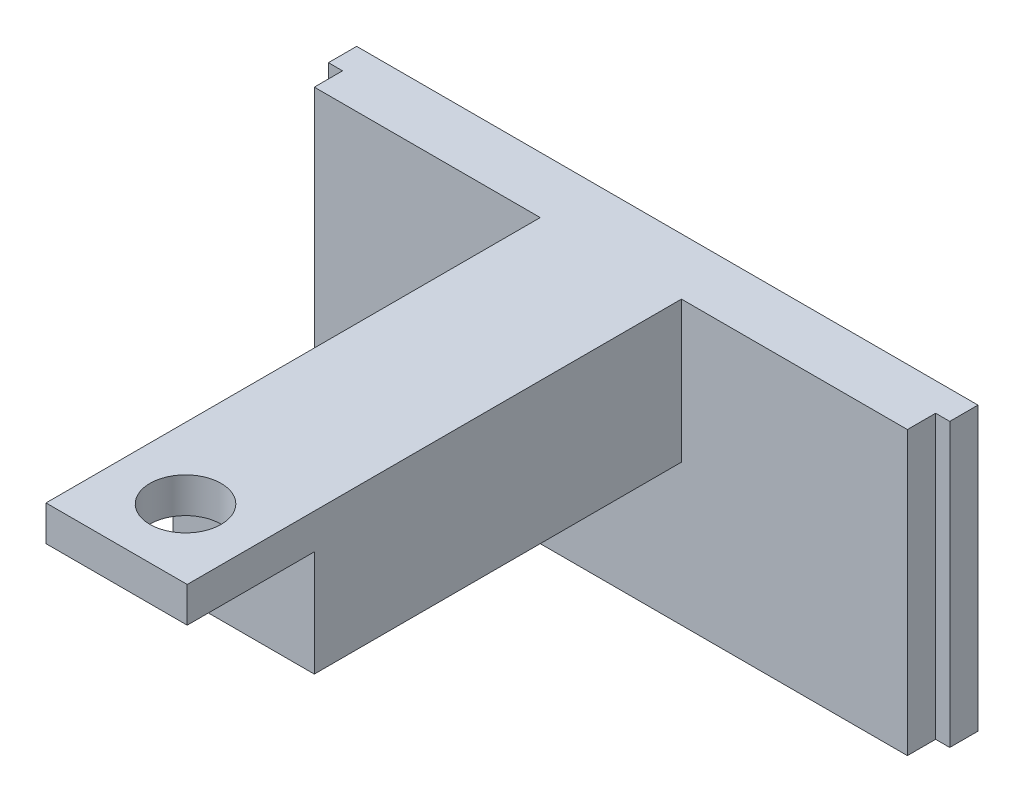
ISO-10303-21;
HEADER;
FILE_DESCRIPTION(('STEP AP214'),'2;1');
FILE_NAME('part.step','',(''),(''),'','','');
FILE_SCHEMA(('AUTOMOTIVE_DESIGN { 1 0 10303 214 1 1 1 1 }'));
ENDSEC;
DATA;
#1=APPLICATION_CONTEXT('core data for automotive mechanical design processes');
#2=APPLICATION_PROTOCOL_DEFINITION('international standard','automotive_design',2000,#1);
#3=PRODUCT_CONTEXT('',#1,'mechanical');
#4=PRODUCT('Part','Part','',(#3));
#5=PRODUCT_RELATED_PRODUCT_CATEGORY('part','',(#4));
#6=PRODUCT_DEFINITION_FORMATION('','',#4);
#7=PRODUCT_DEFINITION_CONTEXT('part definition',#1,'design');
#8=PRODUCT_DEFINITION('design','',#6,#7);
#9=PRODUCT_DEFINITION_SHAPE('','',#8);
#10=(LENGTH_UNIT() NAMED_UNIT(*) SI_UNIT(.MILLI.,.METRE.));
#11=(NAMED_UNIT(*) PLANE_ANGLE_UNIT() SI_UNIT($,.RADIAN.));
#12=(NAMED_UNIT(*) SI_UNIT($,.STERADIAN.) SOLID_ANGLE_UNIT());
#13=UNCERTAINTY_MEASURE_WITH_UNIT(LENGTH_MEASURE(1.E-05),#10,'distance_accuracy_value','');
#14=(GEOMETRIC_REPRESENTATION_CONTEXT(3) GLOBAL_UNCERTAINTY_ASSIGNED_CONTEXT((#13)) GLOBAL_UNIT_ASSIGNED_CONTEXT((#10,
#11,#12)) REPRESENTATION_CONTEXT('',''));
#15=CARTESIAN_POINT('',(0.,0.,0.));
#16=DIRECTION('',(0.,0.,1.));
#17=DIRECTION('',(1.,0.,0.));
#18=AXIS2_PLACEMENT_3D('',#15,#16,#17);
#19=CARTESIAN_POINT('',(5.,10.,39.));
#20=DIRECTION('',(-1.,0.,0.));
#21=DIRECTION('',(0.,-1.,0.));
#22=AXIS2_PLACEMENT_3D('',#19,#20,#21);
#23=PLANE('',#22);
#24=DIRECTION('',(0.,1.,0.));
#25=VECTOR('',#24,1.);
#26=CARTESIAN_POINT('',(4.99999999999999,7.5,30.));
#27=LINE('',#26,#25);
#28=CARTESIAN_POINT('',(4.99999999999999,0.,30.));
#29=VERTEX_POINT('',#28);
#30=CARTESIAN_POINT('',(4.99999999999999,7.5,30.));
#31=VERTEX_POINT('',#30);
#32=EDGE_CURVE('E147',#29,#31,#27,.T.);
#33=ORIENTED_EDGE('',*,*,#32,.F.);
#34=DIRECTION('',(0.,0.,-1.));
#35=VECTOR('',#34,1.);
#36=CARTESIAN_POINT('',(5.,0.,39.));
#37=LINE('',#36,#35);
#38=CARTESIAN_POINT('',(5.,0.,4.));
#39=VERTEX_POINT('',#38);
#40=EDGE_CURVE('E65',#29,#39,#37,.T.);
#41=ORIENTED_EDGE('',*,*,#40,.T.);
#42=DIRECTION('',(0.,1.,0.));
#43=VECTOR('',#42,1.);
#44=CARTESIAN_POINT('',(5.,10.,4.));
#45=LINE('',#44,#43);
#46=CARTESIAN_POINT('',(4.99999999999999,10.,4.));
#47=VERTEX_POINT('',#46);
#48=EDGE_CURVE('E169',#39,#47,#45,.T.);
#49=ORIENTED_EDGE('',*,*,#48,.T.);
#50=DIRECTION('',(0.,0.,-1.));
#51=VECTOR('',#50,1.);
#52=CARTESIAN_POINT('',(5.,10.,39.));
#53=LINE('',#52,#51);
#54=CARTESIAN_POINT('',(5.,10.,39.));
#55=VERTEX_POINT('',#54);
#56=EDGE_CURVE('E190',#55,#47,#53,.T.);
#57=ORIENTED_EDGE('',*,*,#56,.F.);
#58=DIRECTION('',(0.,1.,0.));
#59=VECTOR('',#58,1.);
#60=CARTESIAN_POINT('',(5.,10.,39.));
#61=LINE('',#60,#59);
#62=CARTESIAN_POINT('',(5.,7.5,39.));
#63=VERTEX_POINT('',#62);
#64=EDGE_CURVE('E157',#63,#55,#61,.T.);
#65=ORIENTED_EDGE('',*,*,#64,.F.);
#66=DIRECTION('',(0.,0.,1.));
#67=VECTOR('',#66,1.);
#68=CARTESIAN_POINT('',(4.99999999999999,7.5,30.));
#69=LINE('',#68,#67);
#70=EDGE_CURVE('E54',#31,#63,#69,.T.);
#71=ORIENTED_EDGE('',*,*,#70,.F.);
#72=EDGE_LOOP('',(#33,#41,#49,#57,#65,#71));
#73=FACE_BOUND('',#72,.T.);
#74=ADVANCED_FACE('F39',(#73),#23,.F.);
#75=CARTESIAN_POINT('',(-5.,0.,39.));
#76=DIRECTION('',(0.,1.,0.));
#77=DIRECTION('',(-1.,0.,0.));
#78=AXIS2_PLACEMENT_3D('',#75,#76,#77);
#79=PLANE('',#78);
#80=DIRECTION('',(1.,0.,0.));
#81=VECTOR('',#80,1.);
#82=CARTESIAN_POINT('',(-5.00000000000001,0.,30.));
#83=LINE('',#82,#81);
#84=CARTESIAN_POINT('',(-5.00000000000001,0.,30.));
#85=VERTEX_POINT('',#84);
#86=EDGE_CURVE('E152',#85,#29,#83,.T.);
#87=ORIENTED_EDGE('',*,*,#86,.F.);
#88=DIRECTION('',(0.,0.,-1.));
#89=VECTOR('',#88,1.);
#90=CARTESIAN_POINT('',(-5.,0.,39.));
#91=LINE('',#90,#89);
#92=CARTESIAN_POINT('',(-5.,0.,4.));
#93=VERTEX_POINT('',#92);
#94=EDGE_CURVE('E181',#85,#93,#91,.T.);
#95=ORIENTED_EDGE('',*,*,#94,.T.);
#96=DIRECTION('',(1.,0.,0.));
#97=VECTOR('',#96,1.);
#98=CARTESIAN_POINT('',(-5.,0.,4.));
#99=LINE('',#98,#97);
#100=EDGE_CURVE('E174',#93,#39,#99,.T.);
#101=ORIENTED_EDGE('',*,*,#100,.T.);
#102=ORIENTED_EDGE('',*,*,#40,.F.);
#103=EDGE_LOOP('',(#87,#95,#101,#102));
#104=FACE_BOUND('',#103,.T.);
#105=ADVANCED_FACE('F293',(#104),#79,.F.);
#106=CARTESIAN_POINT('',(0.,0.,2.));
#107=DIRECTION('',(0.,0.,1.));
#108=DIRECTION('',(1.,0.,0.));
#109=AXIS2_PLACEMENT_3D('',#106,#107,#108);
#110=PLANE('',#109);
#111=DIRECTION('',(0.,1.,0.));
#112=VECTOR('',#111,1.);
#113=CARTESIAN_POINT('',(21.,10.,2.));
#114=LINE('',#113,#112);
#115=CARTESIAN_POINT('',(21.,-10.,2.));
#116=VERTEX_POINT('',#115);
#117=CARTESIAN_POINT('',(21.,10.,2.));
#118=VERTEX_POINT('',#117);
#119=EDGE_CURVE('E193',#116,#118,#114,.T.);
#120=ORIENTED_EDGE('',*,*,#119,.F.);
#121=DIRECTION('',(1.,0.,0.));
#122=VECTOR('',#121,1.);
#123=CARTESIAN_POINT('',(-22.,-10.,2.));
#124=LINE('',#123,#122);
#125=CARTESIAN_POINT('',(22.,-10.,2.));
#126=VERTEX_POINT('',#125);
#127=EDGE_CURVE('E228',#116,#126,#124,.T.);
#128=ORIENTED_EDGE('',*,*,#127,.T.);
#129=DIRECTION('',(0.,1.,0.));
#130=VECTOR('',#129,1.);
#131=CARTESIAN_POINT('',(22.,10.,2.));
#132=LINE('',#131,#130);
#133=CARTESIAN_POINT('',(22.,10.,2.));
#134=VERTEX_POINT('',#133);
#135=EDGE_CURVE('E219',#126,#134,#132,.T.);
#136=ORIENTED_EDGE('',*,*,#135,.T.);
#137=DIRECTION('',(-1.,0.,0.));
#138=VECTOR('',#137,1.);
#139=CARTESIAN_POINT('',(-22.,10.,2.));
#140=LINE('',#139,#138);
#141=EDGE_CURVE('E223',#134,#118,#140,.T.);
#142=ORIENTED_EDGE('',*,*,#141,.T.);
#143=EDGE_LOOP('',(#120,#128,#136,#142));
#144=FACE_BOUND('',#143,.T.);
#145=ADVANCED_FACE('F270',(#144),#110,.T.);
#146=CARTESIAN_POINT('',(22.,10.,2.));
#147=DIRECTION('',(-1.,0.,0.));
#148=DIRECTION('',(0.,-1.,0.));
#149=AXIS2_PLACEMENT_3D('',#146,#147,#148);
#150=PLANE('',#149);
#151=DIRECTION('',(0.,1.,0.));
#152=VECTOR('',#151,1.);
#153=CARTESIAN_POINT('',(22.,10.,0.));
#154=LINE('',#153,#152);
#155=CARTESIAN_POINT('',(22.,-10.,0.));
#156=VERTEX_POINT('',#155);
#157=CARTESIAN_POINT('',(22.,10.,0.));
#158=VERTEX_POINT('',#157);
#159=EDGE_CURVE('E218',#156,#158,#154,.T.);
#160=ORIENTED_EDGE('',*,*,#159,.T.);
#161=DIRECTION('',(0.,0.,-1.));
#162=VECTOR('',#161,1.);
#163=CARTESIAN_POINT('',(22.,10.,2.));
#164=LINE('',#163,#162);
#165=EDGE_CURVE('E11',#134,#158,#164,.T.);
#166=ORIENTED_EDGE('',*,*,#165,.F.);
#167=ORIENTED_EDGE('',*,*,#135,.F.);
#168=DIRECTION('',(0.,0.,-1.));
#169=VECTOR('',#168,1.);
#170=CARTESIAN_POINT('',(22.,-10.,2.));
#171=LINE('',#170,#169);
#172=EDGE_CURVE('E235',#126,#156,#171,.T.);
#173=ORIENTED_EDGE('',*,*,#172,.T.);
#174=EDGE_LOOP('',(#160,#166,#167,#173));
#175=FACE_BOUND('',#174,.T.);
#176=ADVANCED_FACE('F41',(#175),#150,.F.);
#177=CARTESIAN_POINT('',(-22.,10.,2.));
#178=DIRECTION('',(0.,-1.,0.));
#179=DIRECTION('',(0.,0.,-1.));
#180=AXIS2_PLACEMENT_3D('',#177,#178,#179);
#181=PLANE('',#180);
#182=CARTESIAN_POINT('',(0.,10.,34.12));
#183=DIRECTION('',(0.,1.,0.));
#184=DIRECTION('',(0.,0.,1.));
#185=AXIS2_PLACEMENT_3D('',#182,#183,#184);
#186=CIRCLE('',#185,2.52);
#187=CARTESIAN_POINT('',(0.,10.,36.64));
#188=VERTEX_POINT('',#187);
#189=EDGE_CURVE('E164',#188,#188,#186,.T.);
#190=ORIENTED_EDGE('',*,*,#189,.F.);
#191=EDGE_LOOP('',(#190));
#192=FACE_BOUND('',#191,.T.);
#193=DIRECTION('',(-1.,0.,0.));
#194=VECTOR('',#193,1.);
#195=CARTESIAN_POINT('',(-22.,10.,0.));
#196=LINE('',#195,#194);
#197=CARTESIAN_POINT('',(-22.,10.,0.));
#198=VERTEX_POINT('',#197);
#199=EDGE_CURVE('E234',#158,#198,#196,.T.);
#200=ORIENTED_EDGE('',*,*,#199,.T.);
#201=DIRECTION('',(0.,0.,-1.));
#202=VECTOR('',#201,1.);
#203=CARTESIAN_POINT('',(-22.,10.,2.));
#204=LINE('',#203,#202);
#205=CARTESIAN_POINT('',(-22.,10.,2.));
#206=VERTEX_POINT('',#205);
#207=EDGE_CURVE('E48',#206,#198,#204,.T.);
#208=ORIENTED_EDGE('',*,*,#207,.F.);
#209=CARTESIAN_POINT('',(-21.,10.,2.));
#210=VERTEX_POINT('',#209);
#211=EDGE_CURVE('E224',#210,#206,#140,.T.);
#212=ORIENTED_EDGE('',*,*,#211,.F.);
#213=DIRECTION('',(0.,0.,-1.));
#214=VECTOR('',#213,1.);
#215=CARTESIAN_POINT('',(-21.,10.,4.));
#216=LINE('',#215,#214);
#217=CARTESIAN_POINT('',(-21.,10.,4.));
#218=VERTEX_POINT('',#217);
#219=EDGE_CURVE('E213',#218,#210,#216,.T.);
#220=ORIENTED_EDGE('',*,*,#219,.F.);
#221=DIRECTION('',(-1.,0.,0.));
#222=VECTOR('',#221,1.);
#223=CARTESIAN_POINT('',(-21.,10.,4.));
#224=LINE('',#223,#222);
#225=CARTESIAN_POINT('',(-5.00000000000001,10.,4.));
#226=VERTEX_POINT('',#225);
#227=EDGE_CURVE('E194',#226,#218,#224,.T.);
#228=ORIENTED_EDGE('',*,*,#227,.F.);
#229=DIRECTION('',(0.,0.,-1.));
#230=VECTOR('',#229,1.);
#231=CARTESIAN_POINT('',(-5.,10.,39.));
#232=LINE('',#231,#230);
#233=CARTESIAN_POINT('',(-5.,10.,39.));
#234=VERTEX_POINT('',#233);
#235=EDGE_CURVE('E183',#234,#226,#232,.T.);
#236=ORIENTED_EDGE('',*,*,#235,.F.);
#237=DIRECTION('',(-1.,0.,0.));
#238=VECTOR('',#237,1.);
#239=CARTESIAN_POINT('',(-5.,10.,39.));
#240=LINE('',#239,#238);
#241=EDGE_CURVE('E168',#55,#234,#240,.T.);
#242=ORIENTED_EDGE('',*,*,#241,.F.);
#243=ORIENTED_EDGE('',*,*,#56,.T.);
#244=CARTESIAN_POINT('',(21.,10.,4.));
#245=VERTEX_POINT('',#244);
#246=EDGE_CURVE('E197',#245,#47,#224,.T.);
#247=ORIENTED_EDGE('',*,*,#246,.F.);
#248=DIRECTION('',(0.,0.,-1.));
#249=VECTOR('',#248,1.);
#250=CARTESIAN_POINT('',(21.,10.,4.));
#251=LINE('',#250,#249);
#252=EDGE_CURVE('E216',#245,#118,#251,.T.);
#253=ORIENTED_EDGE('',*,*,#252,.T.);
#254=ORIENTED_EDGE('',*,*,#141,.F.);
#255=ORIENTED_EDGE('',*,*,#165,.T.);
#256=EDGE_LOOP('',(#200,#208,#212,#220,#228,#236,#242,#243,#247,#253,#254,#255));
#257=FACE_BOUND('',#256,.T.);
#258=ADVANCED_FACE('F285',(#192,#257),#181,.F.);
#259=CARTESIAN_POINT('',(-22.,10.,2.));
#260=DIRECTION('',(1.,0.,0.));
#261=DIRECTION('',(0.,1.,0.));
#262=AXIS2_PLACEMENT_3D('',#259,#260,#261);
#263=PLANE('',#262);
#264=DIRECTION('',(0.,-1.,0.));
#265=VECTOR('',#264,1.);
#266=CARTESIAN_POINT('',(-22.,10.,0.));
#267=LINE('',#266,#265);
#268=CARTESIAN_POINT('',(-22.,-10.,0.));
#269=VERTEX_POINT('',#268);
#270=EDGE_CURVE('E240',#198,#269,#267,.T.);
#271=ORIENTED_EDGE('',*,*,#270,.T.);
#272=DIRECTION('',(0.,0.,-1.));
#273=VECTOR('',#272,1.);
#274=CARTESIAN_POINT('',(-22.,-10.,2.));
#275=LINE('',#274,#273);
#276=CARTESIAN_POINT('',(-22.,-10.,2.));
#277=VERTEX_POINT('',#276);
#278=EDGE_CURVE('E241',#277,#269,#275,.T.);
#279=ORIENTED_EDGE('',*,*,#278,.F.);
#280=DIRECTION('',(0.,-1.,0.));
#281=VECTOR('',#280,1.);
#282=CARTESIAN_POINT('',(-22.,10.,2.));
#283=LINE('',#282,#281);
#284=EDGE_CURVE('E226',#206,#277,#283,.T.);
#285=ORIENTED_EDGE('',*,*,#284,.F.);
#286=ORIENTED_EDGE('',*,*,#207,.T.);
#287=EDGE_LOOP('',(#271,#279,#285,#286));
#288=FACE_BOUND('',#287,.T.);
#289=ADVANCED_FACE('F249',(#288),#263,.F.);
#290=CARTESIAN_POINT('',(-22.,-10.,2.));
#291=DIRECTION('',(0.,1.,0.));
#292=DIRECTION('',(0.,0.,1.));
#293=AXIS2_PLACEMENT_3D('',#290,#291,#292);
#294=PLANE('',#293);
#295=DIRECTION('',(1.,0.,0.));
#296=VECTOR('',#295,1.);
#297=CARTESIAN_POINT('',(-22.,-10.,0.));
#298=LINE('',#297,#296);
#299=EDGE_CURVE('E221',#269,#156,#298,.T.);
#300=ORIENTED_EDGE('',*,*,#299,.T.);
#301=ORIENTED_EDGE('',*,*,#172,.F.);
#302=ORIENTED_EDGE('',*,*,#127,.F.);
#303=DIRECTION('',(0.,0.,-1.));
#304=VECTOR('',#303,1.);
#305=CARTESIAN_POINT('',(21.,-10.,4.));
#306=LINE('',#305,#304);
#307=CARTESIAN_POINT('',(21.,-10.,4.));
#308=VERTEX_POINT('',#307);
#309=EDGE_CURVE('E201',#308,#116,#306,.T.);
#310=ORIENTED_EDGE('',*,*,#309,.F.);
#311=DIRECTION('',(1.,0.,0.));
#312=VECTOR('',#311,1.);
#313=CARTESIAN_POINT('',(-21.,-10.,4.));
#314=LINE('',#313,#312);
#315=CARTESIAN_POINT('',(-21.,-10.,4.));
#316=VERTEX_POINT('',#315);
#317=EDGE_CURVE('E203',#316,#308,#314,.T.);
#318=ORIENTED_EDGE('',*,*,#317,.F.);
#319=DIRECTION('',(0.,0.,-1.));
#320=VECTOR('',#319,1.);
#321=CARTESIAN_POINT('',(-21.,-10.,4.));
#322=LINE('',#321,#320);
#323=CARTESIAN_POINT('',(-21.,-10.,2.));
#324=VERTEX_POINT('',#323);
#325=EDGE_CURVE('E209',#316,#324,#322,.T.);
#326=ORIENTED_EDGE('',*,*,#325,.T.);
#327=EDGE_CURVE('E227',#277,#324,#124,.T.);
#328=ORIENTED_EDGE('',*,*,#327,.F.);
#329=ORIENTED_EDGE('',*,*,#278,.T.);
#330=EDGE_LOOP('',(#300,#301,#302,#310,#318,#326,#328,#329));
#331=FACE_BOUND('',#330,.T.);
#332=ADVANCED_FACE('F257',(#331),#294,.F.);
#333=DIRECTION('',(0.,-1.,0.));
#334=VECTOR('',#333,1.);
#335=CARTESIAN_POINT('',(-21.,10.,2.));
#336=LINE('',#335,#334);
#337=EDGE_CURVE('E198',#210,#324,#336,.T.);
#338=ORIENTED_EDGE('',*,*,#337,.F.);
#339=ORIENTED_EDGE('',*,*,#211,.T.);
#340=ORIENTED_EDGE('',*,*,#284,.T.);
#341=ORIENTED_EDGE('',*,*,#327,.T.);
#342=EDGE_LOOP('',(#338,#339,#340,#341));
#343=FACE_BOUND('',#342,.T.);
#344=ADVANCED_FACE('F281',(#343),#110,.T.);
#345=CARTESIAN_POINT('',(0.,0.,0.));
#346=DIRECTION('',(0.,0.,1.));
#347=DIRECTION('',(1.,0.,0.));
#348=AXIS2_PLACEMENT_3D('',#345,#346,#347);
#349=PLANE('',#348);
#350=ORIENTED_EDGE('',*,*,#159,.F.);
#351=ORIENTED_EDGE('',*,*,#299,.F.);
#352=ORIENTED_EDGE('',*,*,#270,.F.);
#353=ORIENTED_EDGE('',*,*,#199,.F.);
#354=EDGE_LOOP('',(#350,#351,#352,#353));
#355=FACE_BOUND('',#354,.T.);
#356=ADVANCED_FACE('F260',(#355),#349,.F.);
#357=CARTESIAN_POINT('',(21.,10.,4.));
#358=DIRECTION('',(-1.,0.,0.));
#359=DIRECTION('',(0.,-1.,0.));
#360=AXIS2_PLACEMENT_3D('',#357,#358,#359);
#361=PLANE('',#360);
#362=ORIENTED_EDGE('',*,*,#119,.T.);
#363=ORIENTED_EDGE('',*,*,#252,.F.);
#364=DIRECTION('',(0.,1.,0.));
#365=VECTOR('',#364,1.);
#366=CARTESIAN_POINT('',(21.,10.,4.));
#367=LINE('',#366,#365);
#368=EDGE_CURVE('E195',#308,#245,#367,.T.);
#369=ORIENTED_EDGE('',*,*,#368,.F.);
#370=ORIENTED_EDGE('',*,*,#309,.T.);
#371=EDGE_LOOP('',(#362,#363,#369,#370));
#372=FACE_BOUND('',#371,.T.);
#373=ADVANCED_FACE('F275',(#372),#361,.F.);
#374=CARTESIAN_POINT('',(-21.,10.,4.));
#375=DIRECTION('',(1.,0.,0.));
#376=DIRECTION('',(0.,1.,0.));
#377=AXIS2_PLACEMENT_3D('',#374,#375,#376);
#378=PLANE('',#377);
#379=ORIENTED_EDGE('',*,*,#337,.T.);
#380=ORIENTED_EDGE('',*,*,#325,.F.);
#381=DIRECTION('',(0.,-1.,0.));
#382=VECTOR('',#381,1.);
#383=CARTESIAN_POINT('',(-21.,10.,4.));
#384=LINE('',#383,#382);
#385=EDGE_CURVE('E200',#218,#316,#384,.T.);
#386=ORIENTED_EDGE('',*,*,#385,.F.);
#387=ORIENTED_EDGE('',*,*,#219,.T.);
#388=EDGE_LOOP('',(#379,#380,#386,#387));
#389=FACE_BOUND('',#388,.T.);
#390=ADVANCED_FACE('F276',(#389),#378,.F.);
#391=CARTESIAN_POINT('',(0.,0.,4.));
#392=DIRECTION('',(0.,0.,1.));
#393=DIRECTION('',(1.,0.,0.));
#394=AXIS2_PLACEMENT_3D('',#391,#392,#393);
#395=PLANE('',#394);
#396=ORIENTED_EDGE('',*,*,#48,.F.);
#397=ORIENTED_EDGE('',*,*,#100,.F.);
#398=DIRECTION('',(0.,-1.,0.));
#399=VECTOR('',#398,1.);
#400=CARTESIAN_POINT('',(-5.,10.,4.));
#401=LINE('',#400,#399);
#402=EDGE_CURVE('E180',#226,#93,#401,.T.);
#403=ORIENTED_EDGE('',*,*,#402,.F.);
#404=ORIENTED_EDGE('',*,*,#227,.T.);
#405=ORIENTED_EDGE('',*,*,#385,.T.);
#406=ORIENTED_EDGE('',*,*,#317,.T.);
#407=ORIENTED_EDGE('',*,*,#368,.T.);
#408=ORIENTED_EDGE('',*,*,#246,.T.);
#409=EDGE_LOOP('',(#396,#397,#403,#404,#405,#406,#407,#408));
#410=FACE_BOUND('',#409,.T.);
#411=ADVANCED_FACE('F274',(#410),#395,.T.);
#412=CARTESIAN_POINT('',(-5.,10.,39.));
#413=DIRECTION('',(1.,0.,0.));
#414=DIRECTION('',(0.,1.,0.));
#415=AXIS2_PLACEMENT_3D('',#412,#413,#414);
#416=PLANE('',#415);
#417=DIRECTION('',(0.,-1.,0.));
#418=VECTOR('',#417,1.);
#419=CARTESIAN_POINT('',(-5.00000000000001,7.5,30.));
#420=LINE('',#419,#418);
#421=CARTESIAN_POINT('',(-5.00000000000001,7.5,30.));
#422=VERTEX_POINT('',#421);
#423=EDGE_CURVE('E149',#422,#85,#420,.T.);
#424=ORIENTED_EDGE('',*,*,#423,.F.);
#425=DIRECTION('',(0.,0.,1.));
#426=VECTOR('',#425,1.);
#427=CARTESIAN_POINT('',(-5.00000000000001,7.5,30.));
#428=LINE('',#427,#426);
#429=CARTESIAN_POINT('',(-5.00000000000001,7.5,39.));
#430=VERTEX_POINT('',#429);
#431=EDGE_CURVE('E148',#422,#430,#428,.T.);
#432=ORIENTED_EDGE('',*,*,#431,.T.);
#433=DIRECTION('',(0.,-1.,0.));
#434=VECTOR('',#433,1.);
#435=CARTESIAN_POINT('',(-5.,10.,39.));
#436=LINE('',#435,#434);
#437=EDGE_CURVE('E175',#234,#430,#436,.T.);
#438=ORIENTED_EDGE('',*,*,#437,.F.);
#439=ORIENTED_EDGE('',*,*,#235,.T.);
#440=ORIENTED_EDGE('',*,*,#402,.T.);
#441=ORIENTED_EDGE('',*,*,#94,.F.);
#442=EDGE_LOOP('',(#424,#432,#438,#439,#440,#441));
#443=FACE_BOUND('',#442,.T.);
#444=ADVANCED_FACE('F287',(#443),#416,.F.);
#445=CARTESIAN_POINT('',(0.,0.,39.));
#446=DIRECTION('',(0.,0.,1.));
#447=DIRECTION('',(1.,0.,0.));
#448=AXIS2_PLACEMENT_3D('',#445,#446,#447);
#449=PLANE('',#448);
#450=DIRECTION('',(-1.,0.,0.));
#451=VECTOR('',#450,1.);
#452=CARTESIAN_POINT('',(-5.00000000000001,7.5,39.));
#453=LINE('',#452,#451);
#454=EDGE_CURVE('E154',#63,#430,#453,.T.);
#455=ORIENTED_EDGE('',*,*,#454,.F.);
#456=ORIENTED_EDGE('',*,*,#64,.T.);
#457=ORIENTED_EDGE('',*,*,#241,.T.);
#458=ORIENTED_EDGE('',*,*,#437,.T.);
#459=EDGE_LOOP('',(#455,#456,#457,#458));
#460=FACE_BOUND('',#459,.T.);
#461=ADVANCED_FACE('F295',(#460),#449,.T.);
#462=CARTESIAN_POINT('',(0.,-0.999999999999984,34.12));
#463=DIRECTION('',(0.,1.,0.));
#464=DIRECTION('',(0.,0.,1.));
#465=AXIS2_PLACEMENT_3D('',#462,#463,#464);
#466=CYLINDRICAL_SURFACE('',#465,2.52);
#467=CARTESIAN_POINT('',(0.,7.5,34.12));
#468=DIRECTION('',(0.,1.,0.));
#469=DIRECTION('',(0.,0.,1.));
#470=AXIS2_PLACEMENT_3D('',#467,#468,#469);
#471=CIRCLE('',#470,2.52);
#472=CARTESIAN_POINT('',(0.,7.5,36.64));
#473=VERTEX_POINT('',#472);
#474=EDGE_CURVE('E43',#473,#473,#471,.F.);
#475=ORIENTED_EDGE('',*,*,#474,.T.);
#476=EDGE_LOOP('',(#475));
#477=FACE_BOUND('',#476,.T.);
#478=ORIENTED_EDGE('',*,*,#189,.T.);
#479=EDGE_LOOP('',(#478));
#480=FACE_BOUND('',#479,.T.);
#481=ADVANCED_FACE('F328',(#477,#480),#466,.F.);
#482=CARTESIAN_POINT('',(-5.00000000000001,7.5,30.));
#483=DIRECTION('',(0.,1.,0.));
#484=DIRECTION('',(0.,0.,1.));
#485=AXIS2_PLACEMENT_3D('',#482,#483,#484);
#486=PLANE('',#485);
#487=ORIENTED_EDGE('',*,*,#454,.T.);
#488=ORIENTED_EDGE('',*,*,#431,.F.);
#489=DIRECTION('',(-1.,0.,0.));
#490=VECTOR('',#489,1.);
#491=CARTESIAN_POINT('',(-5.00000000000001,7.5,30.));
#492=LINE('',#491,#490);
#493=EDGE_CURVE('E143',#31,#422,#492,.T.);
#494=ORIENTED_EDGE('',*,*,#493,.F.);
#495=ORIENTED_EDGE('',*,*,#70,.T.);
#496=EDGE_LOOP('',(#487,#488,#494,#495));
#497=FACE_BOUND('',#496,.T.);
#498=ORIENTED_EDGE('',*,*,#474,.F.);
#499=EDGE_LOOP('',(#498));
#500=FACE_BOUND('',#499,.T.);
#501=ADVANCED_FACE('F141',(#497,#500),#486,.F.);
#502=CARTESIAN_POINT('',(0.,0.,30.));
#503=DIRECTION('',(0.,0.,1.));
#504=DIRECTION('',(1.,0.,0.));
#505=AXIS2_PLACEMENT_3D('',#502,#503,#504);
#506=PLANE('',#505);
#507=ORIENTED_EDGE('',*,*,#32,.T.);
#508=ORIENTED_EDGE('',*,*,#493,.T.);
#509=ORIENTED_EDGE('',*,*,#423,.T.);
#510=ORIENTED_EDGE('',*,*,#86,.T.);
#511=EDGE_LOOP('',(#507,#508,#509,#510));
#512=FACE_BOUND('',#511,.T.);
#513=ADVANCED_FACE('F155',(#512),#506,.T.);
#514=CLOSED_SHELL('',(#74,#105,#145,#176,#258,#289,#332,#344,#356,#373,#390,#411,#444,#461,#481,
#501,#513));
#515=MANIFOLD_SOLID_BREP('B2',#514);
#516=ADVANCED_BREP_SHAPE_REPRESENTATION('',(#18,#515),#14);
#517=SHAPE_DEFINITION_REPRESENTATION(#9,#516);
ENDSEC;
END-ISO-10303-21;
